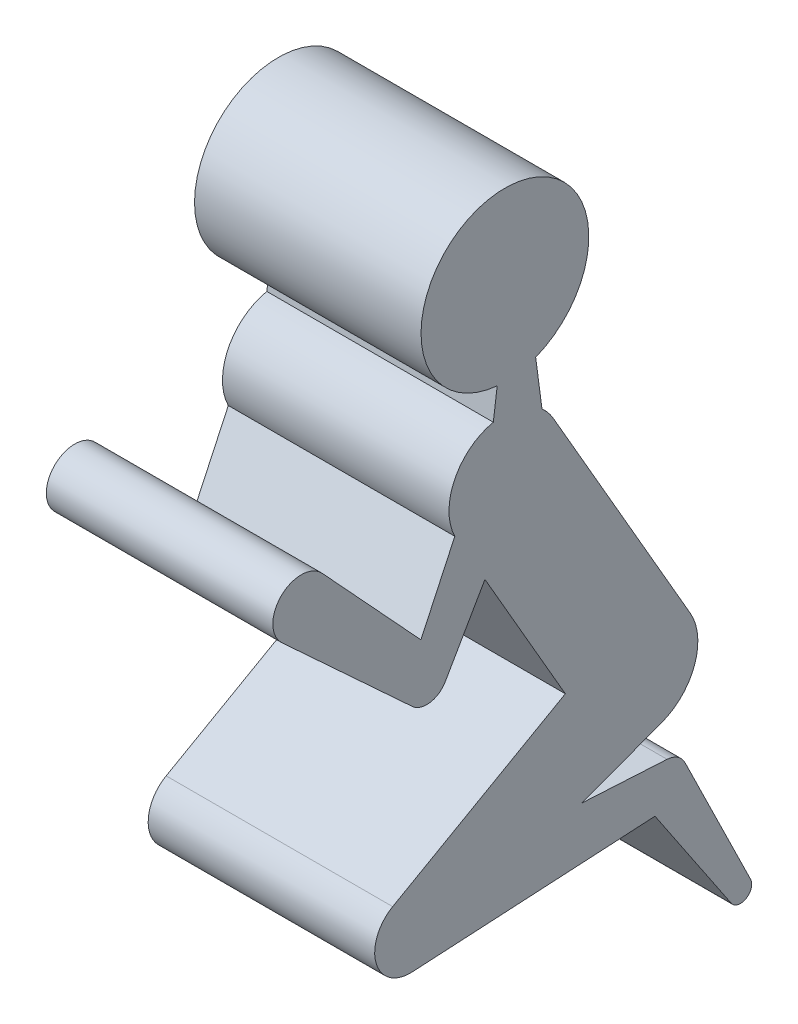
ISO-10303-21;
HEADER;
FILE_DESCRIPTION(('STEP AP214'),'2;1');
FILE_NAME('part.step','',(''),(''),'','','');
FILE_SCHEMA(('AUTOMOTIVE_DESIGN { 1 0 10303 214 1 1 1 1 }'));
ENDSEC;
DATA;
#1=APPLICATION_CONTEXT('core data for automotive mechanical design processes');
#2=APPLICATION_PROTOCOL_DEFINITION('international standard','automotive_design',2000,#1);
#3=PRODUCT_CONTEXT('',#1,'mechanical');
#4=PRODUCT('Part','Part','',(#3));
#5=PRODUCT_RELATED_PRODUCT_CATEGORY('part','',(#4));
#6=PRODUCT_DEFINITION_FORMATION('','',#4);
#7=PRODUCT_DEFINITION_CONTEXT('part definition',#1,'design');
#8=PRODUCT_DEFINITION('design','',#6,#7);
#9=PRODUCT_DEFINITION_SHAPE('','',#8);
#10=(LENGTH_UNIT() NAMED_UNIT(*) SI_UNIT(.MILLI.,.METRE.));
#11=(NAMED_UNIT(*) PLANE_ANGLE_UNIT() SI_UNIT($,.RADIAN.));
#12=(NAMED_UNIT(*) SI_UNIT($,.STERADIAN.) SOLID_ANGLE_UNIT());
#13=UNCERTAINTY_MEASURE_WITH_UNIT(LENGTH_MEASURE(1.E-05),#10,'distance_accuracy_value','');
#14=(GEOMETRIC_REPRESENTATION_CONTEXT(3) GLOBAL_UNCERTAINTY_ASSIGNED_CONTEXT((#13)) GLOBAL_UNIT_ASSIGNED_CONTEXT((#10,
#11,#12)) REPRESENTATION_CONTEXT('',''));
#15=CARTESIAN_POINT('',(0.,0.,0.));
#16=DIRECTION('',(0.,0.,1.));
#17=DIRECTION('',(1.,0.,0.));
#18=AXIS2_PLACEMENT_3D('',#15,#16,#17);
#19=CARTESIAN_POINT('',(202.5,-63.4019304434073,-3.52777777777764));
#20=DIRECTION('',(0.,0.998455597533968,0.055555555555553));
#21=DIRECTION('',(0.,-0.055555555555553,0.998455597533968));
#22=AXIS2_PLACEMENT_3D('',#19,#20,#21);
#23=PLANE('',#22);
#24=DIRECTION('',(0.,0.055555555555553,-0.998455597533968));
#25=VECTOR('',#24,1.);
#26=CARTESIAN_POINT('',(-202.5,-63.4019304434073,-3.52777777777764));
#27=LINE('',#26,#25);
#28=CARTESIAN_POINT('',(-202.5,-63.4019304434073,-3.52777777777763));
#29=VERTEX_POINT('',#28);
#30=CARTESIAN_POINT('',(-202.5,-39.2458724527599,-437.665301449903));
#31=VERTEX_POINT('',#30);
#32=EDGE_CURVE('E228',#29,#31,#27,.T.);
#33=ORIENTED_EDGE('',*,*,#32,.T.);
#34=DIRECTION('',(-1.,0.,0.));
#35=VECTOR('',#34,1.);
#36=CARTESIAN_POINT('',(202.5,-39.2458724527599,-437.665301449903));
#37=LINE('',#36,#35);
#38=CARTESIAN_POINT('',(202.5,-39.2458724527599,-437.665301449903));
#39=VERTEX_POINT('',#38);
#40=EDGE_CURVE('E13',#39,#31,#37,.T.);
#41=ORIENTED_EDGE('',*,*,#40,.F.);
#42=DIRECTION('',(0.,0.055555555555553,-0.998455597533968));
#43=VECTOR('',#42,1.);
#44=CARTESIAN_POINT('',(202.5,-63.4019304434073,-3.52777777777764));
#45=LINE('',#44,#43);
#46=CARTESIAN_POINT('',(202.5,-63.4019304434073,-3.52777777777763));
#47=VERTEX_POINT('',#46);
#48=EDGE_CURVE('E280',#47,#39,#45,.T.);
#49=ORIENTED_EDGE('',*,*,#48,.F.);
#50=DIRECTION('',(-1.,0.,0.));
#51=VECTOR('',#50,1.);
#52=CARTESIAN_POINT('',(202.5,-63.4019304434073,-3.52777777777763));
#53=LINE('',#52,#51);
#54=EDGE_CURVE('E224',#47,#29,#53,.T.);
#55=ORIENTED_EDGE('',*,*,#54,.T.);
#56=EDGE_LOOP('',(#33,#41,#49,#55));
#57=FACE_BOUND('',#56,.T.);
#58=ADVANCED_FACE('F44',(#57),#23,.F.);
#59=CARTESIAN_POINT('',(202.5,190.382873454475,-283.410886607806));
#60=DIRECTION('',(0.,0.55762133255797,-0.830095446003816));
#61=DIRECTION('',(0.,0.830095446003816,0.55762133255797));
#62=AXIS2_PLACEMENT_3D('',#59,#60,#61);
#63=PLANE('',#62);
#64=DIRECTION('',(0.,-0.830095446003816,-0.55762133255797));
#65=VECTOR('',#64,1.);
#66=CARTESIAN_POINT('',(-202.5,190.382873454475,-283.410886607806));
#67=LINE('',#66,#65);
#68=CARTESIAN_POINT('',(-202.5,-242.121401840469,-573.948091079925));
#69=VERTEX_POINT('',#68);
#70=EDGE_CURVE('E231',#31,#69,#67,.T.);
#71=ORIENTED_EDGE('',*,*,#70,.T.);
#72=DIRECTION('',(-1.,0.,0.));
#73=VECTOR('',#72,1.);
#74=CARTESIAN_POINT('',(202.5,-242.121401840469,-573.948091079925));
#75=LINE('',#74,#73);
#76=CARTESIAN_POINT('',(202.5,-242.121401840469,-573.948091079925));
#77=VERTEX_POINT('',#76);
#78=EDGE_CURVE('E52',#77,#69,#75,.T.);
#79=ORIENTED_EDGE('',*,*,#78,.F.);
#80=DIRECTION('',(0.,-0.830095446003816,-0.55762133255797));
#81=VECTOR('',#80,1.);
#82=CARTESIAN_POINT('',(202.5,190.382873454475,-283.410886607806));
#83=LINE('',#82,#81);
#84=EDGE_CURVE('E144',#39,#77,#83,.T.);
#85=ORIENTED_EDGE('',*,*,#84,.F.);
#86=ORIENTED_EDGE('',*,*,#40,.T.);
#87=EDGE_LOOP('',(#71,#79,#85,#86));
#88=FACE_BOUND('',#87,.T.);
#89=ADVANCED_FACE('F399',(#88),#63,.F.);
#90=CARTESIAN_POINT('',(202.5,-230.968975189309,-590.550000000001));
#91=DIRECTION('',(-1.,0.,0.));
#92=DIRECTION('',(0.,0.,1.));
#93=AXIS2_PLACEMENT_3D('',#90,#91,#92);
#94=CYLINDRICAL_SURFACE('',#93,20.0000000000001);
#95=CARTESIAN_POINT('',(-202.5,-230.968975189309,-590.550000000001));
#96=DIRECTION('',(1.,0.,0.));
#97=DIRECTION('',(0.,0.,-1.));
#98=AXIS2_PLACEMENT_3D('',#95,#96,#97);
#99=CIRCLE('',#98,20.0000000000001);
#100=CARTESIAN_POINT('',(-202.5,-222.167513638787,-608.509239253786));
#101=VERTEX_POINT('',#100);
#102=EDGE_CURVE('E233',#69,#101,#99,.T.);
#103=ORIENTED_EDGE('',*,*,#102,.T.);
#104=DIRECTION('',(-1.,0.,0.));
#105=VECTOR('',#104,1.);
#106=CARTESIAN_POINT('',(202.5,-222.167513638787,-608.509239253786));
#107=LINE('',#106,#105);
#108=CARTESIAN_POINT('',(202.5,-222.167513638787,-608.509239253786));
#109=VERTEX_POINT('',#108);
#110=EDGE_CURVE('E326',#109,#101,#107,.T.);
#111=ORIENTED_EDGE('',*,*,#110,.F.);
#112=CARTESIAN_POINT('',(202.5,-230.968975189309,-590.550000000001));
#113=DIRECTION('',(1.,0.,0.));
#114=DIRECTION('',(0.,0.,-1.));
#115=AXIS2_PLACEMENT_3D('',#112,#113,#114);
#116=CIRCLE('',#115,20.0000000000001);
#117=EDGE_CURVE('E333',#77,#109,#116,.T.);
#118=ORIENTED_EDGE('',*,*,#117,.F.);
#119=ORIENTED_EDGE('',*,*,#78,.T.);
#120=EDGE_LOOP('',(#103,#111,#118,#119));
#121=FACE_BOUND('',#120,.T.);
#122=ADVANCED_FACE('F331',(#121),#94,.T.);
#123=CARTESIAN_POINT('',(202.5,197.437998211498,-402.869026617323));
#124=DIRECTION('',(0.,0.440073077526103,-0.897961962689236));
#125=DIRECTION('',(0.,0.897961962689236,0.440073077526103));
#126=AXIS2_PLACEMENT_3D('',#123,#124,#125);
#127=PLANE('',#126);
#128=DIRECTION('',(0.,-0.897961962689236,-0.440073077526103));
#129=VECTOR('',#128,1.);
#130=CARTESIAN_POINT('',(-202.5,197.437998211498,-402.869026617323));
#131=LINE('',#130,#129);
#132=CARTESIAN_POINT('',(-202.5,16.7667842537452,-491.412350778461));
#133=VERTEX_POINT('',#132);
#134=EDGE_CURVE('E236',#133,#101,#131,.T.);
#135=ORIENTED_EDGE('',*,*,#134,.F.);
#136=DIRECTION('',(-1.,0.,0.));
#137=VECTOR('',#136,1.);
#138=CARTESIAN_POINT('',(202.5,16.7667842537452,-491.412350778461));
#139=LINE('',#138,#137);
#140=CARTESIAN_POINT('',(202.5,16.7667842537452,-491.412350778461));
#141=VERTEX_POINT('',#140);
#142=EDGE_CURVE('E324',#141,#133,#139,.T.);
#143=ORIENTED_EDGE('',*,*,#142,.F.);
#144=DIRECTION('',(0.,-0.897961962689236,-0.440073077526103));
#145=VECTOR('',#144,1.);
#146=CARTESIAN_POINT('',(202.5,197.437998211498,-402.869026617323));
#147=LINE('',#146,#145);
#148=EDGE_CURVE('E345',#141,#109,#147,.T.);
#149=ORIENTED_EDGE('',*,*,#148,.T.);
#150=ORIENTED_EDGE('',*,*,#110,.T.);
#151=EDGE_LOOP('',(#135,#143,#149,#150));
#152=FACE_BOUND('',#151,.T.);
#153=ADVANCED_FACE('F341',(#152),#127,.T.);
#154=CARTESIAN_POINT('',(202.5,0.,-457.2));
#155=DIRECTION('',(-1.,0.,0.));
#156=DIRECTION('',(0.,0.,1.));
#157=AXIS2_PLACEMENT_3D('',#154,#155,#156);
#158=CYLINDRICAL_SURFACE('',#157,38.1000000000015);
#159=CARTESIAN_POINT('',(-202.5,0.,-457.2));
#160=DIRECTION('',(1.,0.,0.));
#161=DIRECTION('',(0.,0.,-1.));
#162=AXIS2_PLACEMENT_3D('',#159,#160,#161);
#163=CIRCLE('',#162,38.1000000000015);
#164=CARTESIAN_POINT('',(-202.5,38.0411582660456,-459.316666666667));
#165=VERTEX_POINT('',#164);
#166=EDGE_CURVE('E239',#133,#165,#163,.T.);
#167=ORIENTED_EDGE('',*,*,#166,.T.);
#168=DIRECTION('',(-1.,0.,0.));
#169=VECTOR('',#168,1.);
#170=CARTESIAN_POINT('',(202.5,38.0411582660456,-459.316666666667));
#171=LINE('',#170,#169);
#172=CARTESIAN_POINT('',(202.5,38.0411582660456,-459.316666666667));
#173=VERTEX_POINT('',#172);
#174=EDGE_CURVE('E321',#173,#165,#171,.T.);
#175=ORIENTED_EDGE('',*,*,#174,.F.);
#176=CARTESIAN_POINT('',(202.5,0.,-457.2));
#177=DIRECTION('',(1.,0.,0.));
#178=DIRECTION('',(0.,0.,-1.));
#179=AXIS2_PLACEMENT_3D('',#176,#177,#178);
#180=CIRCLE('',#179,38.1000000000015);
#181=EDGE_CURVE('E346',#141,#173,#180,.T.);
#182=ORIENTED_EDGE('',*,*,#181,.F.);
#183=ORIENTED_EDGE('',*,*,#142,.T.);
#184=EDGE_LOOP('',(#167,#175,#182,#183));
#185=FACE_BOUND('',#184,.T.);
#186=ADVANCED_FACE('F410',(#185),#158,.T.);
#187=CARTESIAN_POINT('',(202.5,63.4019304434073,-3.52777777777763));
#188=DIRECTION('',(0.,-0.998455597533968,0.055555555555553));
#189=DIRECTION('',(0.,-0.055555555555553,-0.998455597533968));
#190=AXIS2_PLACEMENT_3D('',#187,#188,#189);
#191=PLANE('',#190);
#192=DIRECTION('',(0.,0.055555555555553,0.998455597533968));
#193=VECTOR('',#192,1.);
#194=CARTESIAN_POINT('',(-202.5,63.4019304434073,-3.52777777777763));
#195=LINE('',#194,#193);
#196=CARTESIAN_POINT('',(-202.5,46.519626158251,-306.939939607939));
#197=VERTEX_POINT('',#196);
#198=EDGE_CURVE('E241',#165,#197,#195,.T.);
#199=ORIENTED_EDGE('',*,*,#198,.T.);
#200=DIRECTION('',(-1.,0.,0.));
#201=VECTOR('',#200,1.);
#202=CARTESIAN_POINT('',(202.5,46.519626158251,-306.939939607939));
#203=LINE('',#202,#201);
#204=CARTESIAN_POINT('',(202.5,46.519626158251,-306.939939607939));
#205=VERTEX_POINT('',#204);
#206=EDGE_CURVE('E318',#205,#197,#203,.T.);
#207=ORIENTED_EDGE('',*,*,#206,.F.);
#208=DIRECTION('',(0.,0.055555555555553,0.998455597533968));
#209=VECTOR('',#208,1.);
#210=CARTESIAN_POINT('',(202.5,63.4019304434073,-3.52777777777763));
#211=LINE('',#210,#209);
#212=EDGE_CURVE('E348',#173,#205,#211,.T.);
#213=ORIENTED_EDGE('',*,*,#212,.F.);
#214=ORIENTED_EDGE('',*,*,#174,.T.);
#215=EDGE_LOOP('',(#199,#207,#213,#214));
#216=FACE_BOUND('',#215,.T.);
#217=ADVANCED_FACE('F413',(#216),#191,.F.);
#218=CARTESIAN_POINT('',(202.5,-59.509293912752,-22.1561264215054));
#219=DIRECTION('',(0.,0.937154234846484,0.348915376716619));
#220=DIRECTION('',(0.,-0.348915376716619,0.937154234846484));
#221=AXIS2_PLACEMENT_3D('',#218,#219,#220);
#222=PLANE('',#221);
#223=DIRECTION('',(0.,0.348915376716619,-0.937154234846484));
#224=VECTOR('',#223,1.);
#225=CARTESIAN_POINT('',(-202.5,-59.509293912752,-22.1561264215054));
#226=LINE('',#225,#224);
#227=CARTESIAN_POINT('',(-202.5,99.5056457831968,-449.255457904819));
#228=VERTEX_POINT('',#227);
#229=EDGE_CURVE('E243',#197,#228,#226,.T.);
#230=ORIENTED_EDGE('',*,*,#229,.T.);
#231=DIRECTION('',(-1.,0.,0.));
#232=VECTOR('',#231,1.);
#233=CARTESIAN_POINT('',(202.5,99.5056457831968,-449.255457904819));
#234=LINE('',#233,#232);
#235=CARTESIAN_POINT('',(202.5,99.5056457831968,-449.255457904819));
#236=VERTEX_POINT('',#235);
#237=EDGE_CURVE('E315',#236,#228,#234,.T.);
#238=ORIENTED_EDGE('',*,*,#237,.F.);
#239=DIRECTION('',(0.,0.348915376716619,-0.937154234846484));
#240=VECTOR('',#239,1.);
#241=CARTESIAN_POINT('',(202.5,-59.509293912752,-22.1561264215054));
#242=LINE('',#241,#240);
#243=EDGE_CURVE('E354',#205,#236,#242,.T.);
#244=ORIENTED_EDGE('',*,*,#243,.F.);
#245=ORIENTED_EDGE('',*,*,#206,.T.);
#246=EDGE_LOOP('',(#230,#238,#244,#245));
#247=FACE_BOUND('',#246,.T.);
#248=ADVANCED_FACE('F417',(#247),#222,.F.);
#249=CARTESIAN_POINT('',(202.5,193.221069267845,-414.363920233158));
#250=DIRECTION('',(-1.,0.,0.));
#251=DIRECTION('',(0.,0.,1.));
#252=AXIS2_PLACEMENT_3D('',#249,#250,#251);
#253=CYLINDRICAL_SURFACE('',#252,100.);
#254=CARTESIAN_POINT('',(-202.5,193.221069267845,-414.363920233158));
#255=DIRECTION('',(1.,0.,0.));
#256=DIRECTION('',(0.,0.,-1.));
#257=AXIS2_PLACEMENT_3D('',#254,#255,#256);
#258=CIRCLE('',#257,100.);
#259=CARTESIAN_POINT('',(-202.5,243.221069267845,-500.966460611602));
#260=VERTEX_POINT('',#259);
#261=EDGE_CURVE('E245',#228,#260,#258,.T.);
#262=ORIENTED_EDGE('',*,*,#261,.T.);
#263=DIRECTION('',(-1.,0.,0.));
#264=VECTOR('',#263,1.);
#265=CARTESIAN_POINT('',(202.5,243.221069267845,-500.966460611602));
#266=LINE('',#265,#264);
#267=CARTESIAN_POINT('',(202.5,243.221069267845,-500.966460611602));
#268=VERTEX_POINT('',#267);
#269=EDGE_CURVE('E312',#268,#260,#266,.T.);
#270=ORIENTED_EDGE('',*,*,#269,.F.);
#271=CARTESIAN_POINT('',(202.5,193.221069267845,-414.363920233158));
#272=DIRECTION('',(1.,0.,0.));
#273=DIRECTION('',(0.,0.,-1.));
#274=AXIS2_PLACEMENT_3D('',#271,#272,#273);
#275=CIRCLE('',#274,100.);
#276=EDGE_CURVE('E356',#236,#268,#275,.T.);
#277=ORIENTED_EDGE('',*,*,#276,.F.);
#278=ORIENTED_EDGE('',*,*,#237,.T.);
#279=EDGE_LOOP('',(#262,#270,#277,#278));
#280=FACE_BOUND('',#279,.T.);
#281=ADVANCED_FACE('F421',(#280),#253,.T.);
#282=CARTESIAN_POINT('',(202.5,277.730107983771,-481.042657819486));
#283=DIRECTION('',(0.,-0.499999999999997,0.86602540378444));
#284=DIRECTION('',(0.,-0.86602540378444,-0.499999999999997));
#285=AXIS2_PLACEMENT_3D('',#282,#283,#284);
#286=PLANE('',#285);
#287=DIRECTION('',(0.,0.86602540378444,0.499999999999997));
#288=VECTOR('',#287,1.);
#289=CARTESIAN_POINT('',(-202.5,277.730107983771,-481.042657819486));
#290=LINE('',#289,#288);
#291=CARTESIAN_POINT('',(-202.5,667.544072258492,-255.983460611603));
#292=VERTEX_POINT('',#291);
#293=EDGE_CURVE('E247',#260,#292,#290,.T.);
#294=ORIENTED_EDGE('',*,*,#293,.T.);
#295=DIRECTION('',(-1.,0.,0.));
#296=VECTOR('',#295,1.);
#297=CARTESIAN_POINT('',(202.5,667.544072258492,-255.983460611603));
#298=LINE('',#297,#296);
#299=CARTESIAN_POINT('',(202.5,667.544072258492,-255.983460611603));
#300=VERTEX_POINT('',#299);
#301=EDGE_CURVE('E309',#300,#292,#298,.T.);
#302=ORIENTED_EDGE('',*,*,#301,.F.);
#303=DIRECTION('',(0.,0.86602540378444,0.499999999999997));
#304=VECTOR('',#303,1.);
#305=CARTESIAN_POINT('',(202.5,277.730107983771,-481.042657819486));
#306=LINE('',#305,#304);
#307=EDGE_CURVE('E358',#268,#300,#306,.T.);
#308=ORIENTED_EDGE('',*,*,#307,.F.);
#309=ORIENTED_EDGE('',*,*,#269,.T.);
#310=EDGE_LOOP('',(#294,#302,#308,#309));
#311=FACE_BOUND('',#310,.T.);
#312=ADVANCED_FACE('F425',(#311),#286,.F.);
#313=CARTESIAN_POINT('',(202.5,617.544072258492,-169.380920233159));
#314=DIRECTION('',(-1.,0.,0.));
#315=DIRECTION('',(0.,0.,1.));
#316=AXIS2_PLACEMENT_3D('',#313,#314,#315);
#317=CYLINDRICAL_SURFACE('',#316,100.);
#318=CARTESIAN_POINT('',(-202.5,617.544072258492,-169.380920233159));
#319=DIRECTION('',(1.,0.,0.));
#320=DIRECTION('',(0.,0.,-1.));
#321=AXIS2_PLACEMENT_3D('',#318,#319,#320);
#322=CIRCLE('',#321,100.);
#323=CARTESIAN_POINT('',(-202.5,692.438569744066,-235.644139641692));
#324=VERTEX_POINT('',#323);
#325=EDGE_CURVE('E249',#292,#324,#322,.T.);
#326=ORIENTED_EDGE('',*,*,#325,.T.);
#327=DIRECTION('',(-1.,0.,0.));
#328=VECTOR('',#327,1.);
#329=CARTESIAN_POINT('',(202.5,692.438569744066,-235.644139641692));
#330=LINE('',#329,#328);
#331=CARTESIAN_POINT('',(202.5,692.438569744066,-235.644139641692));
#332=VERTEX_POINT('',#331);
#333=EDGE_CURVE('E307',#332,#324,#330,.T.);
#334=ORIENTED_EDGE('',*,*,#333,.F.);
#335=CARTESIAN_POINT('',(202.5,617.544072258492,-169.380920233159));
#336=DIRECTION('',(1.,0.,0.));
#337=DIRECTION('',(0.,0.,-1.));
#338=AXIS2_PLACEMENT_3D('',#335,#336,#337);
#339=CIRCLE('',#338,100.);
#340=EDGE_CURVE('E360',#300,#332,#339,.T.);
#341=ORIENTED_EDGE('',*,*,#340,.F.);
#342=ORIENTED_EDGE('',*,*,#301,.T.);
#343=EDGE_LOOP('',(#326,#334,#341,#342));
#344=FACE_BOUND('',#343,.T.);
#345=ADVANCED_FACE('F429',(#344),#317,.T.);
#346=CARTESIAN_POINT('',(202.5,42.291731657835,-321.237594674287));
#347=DIRECTION('',(0.,0.130526192220044,-0.991444861373811));
#348=DIRECTION('',(0.,0.991444861373811,0.130526192220044));
#349=AXIS2_PLACEMENT_3D('',#346,#347,#348);
#350=PLANE('',#349);
#351=DIRECTION('',(0.,-0.991444861373811,-0.130526192220044));
#352=VECTOR('',#351,1.);
#353=CARTESIAN_POINT('',(-202.5,42.291731657835,-321.237594674287));
#354=LINE('',#353,#352);
#355=CARTESIAN_POINT('',(-202.5,777.991214888963,-224.380920233158));
#356=VERTEX_POINT('',#355);
#357=EDGE_CURVE('E252',#356,#324,#354,.T.);
#358=ORIENTED_EDGE('',*,*,#357,.F.);
#359=DIRECTION('',(-1.,0.,0.));
#360=VECTOR('',#359,1.);
#361=CARTESIAN_POINT('',(202.5,777.991214888963,-224.380920233158));
#362=LINE('',#361,#360);
#363=CARTESIAN_POINT('',(202.5,777.991214888963,-224.380920233158));
#364=VERTEX_POINT('',#363);
#365=EDGE_CURVE('E305',#364,#356,#362,.T.);
#366=ORIENTED_EDGE('',*,*,#365,.F.);
#367=DIRECTION('',(0.,-0.991444861373811,-0.130526192220044));
#368=VECTOR('',#367,1.);
#369=CARTESIAN_POINT('',(202.5,42.291731657835,-321.237594674287));
#370=LINE('',#369,#368);
#371=EDGE_CURVE('E362',#364,#332,#370,.T.);
#372=ORIENTED_EDGE('',*,*,#371,.T.);
#373=ORIENTED_EDGE('',*,*,#333,.T.);
#374=EDGE_LOOP('',(#358,#366,#372,#373));
#375=FACE_BOUND('',#374,.T.);
#376=ADVANCED_FACE('F431',(#375),#350,.T.);
#377=CARTESIAN_POINT('',(202.5,917.544072258493,-169.38092023316));
#378=DIRECTION('',(-1.,0.,0.));
#379=DIRECTION('',(0.,0.,1.));
#380=AXIS2_PLACEMENT_3D('',#377,#378,#379);
#381=CYLINDRICAL_SURFACE('',#380,150.000000000001);
#382=CARTESIAN_POINT('',(-202.5,917.544072258493,-169.38092023316));
#383=DIRECTION('',(1.,0.,0.));
#384=DIRECTION('',(0.,0.,-1.));
#385=AXIS2_PLACEMENT_3D('',#382,#383,#384);
#386=CIRCLE('',#385,150.000000000001);
#387=CARTESIAN_POINT('',(-202.5,768.181554300448,-155.5664991728));
#388=VERTEX_POINT('',#387);
#389=EDGE_CURVE('E256',#356,#388,#386,.T.);
#390=ORIENTED_EDGE('',*,*,#389,.T.);
#391=DIRECTION('',(-1.,0.,0.));
#392=VECTOR('',#391,1.);
#393=CARTESIAN_POINT('',(202.5,768.181554300448,-155.5664991728));
#394=LINE('',#393,#392);
#395=CARTESIAN_POINT('',(202.5,768.181554300448,-155.5664991728));
#396=VERTEX_POINT('',#395);
#397=EDGE_CURVE('E302',#396,#388,#394,.T.);
#398=ORIENTED_EDGE('',*,*,#397,.F.);
#399=CARTESIAN_POINT('',(202.5,917.544072258493,-169.38092023316));
#400=DIRECTION('',(1.,0.,0.));
#401=DIRECTION('',(0.,0.,-1.));
#402=AXIS2_PLACEMENT_3D('',#399,#400,#401);
#403=CIRCLE('',#402,150.000000000001);
#404=EDGE_CURVE('E366',#364,#396,#403,.T.);
#405=ORIENTED_EDGE('',*,*,#404,.F.);
#406=ORIENTED_EDGE('',*,*,#365,.T.);
#407=EDGE_LOOP('',(#390,#398,#405,#406));
#408=FACE_BOUND('',#407,.T.);
#409=ADVANCED_FACE('F434',(#408),#381,.T.);
#410=CARTESIAN_POINT('',(202.5,-7.04421052153994,-53.5060910398916));
#411=DIRECTION('',(0.,-0.130526192220045,-0.991444861373811));
#412=DIRECTION('',(0.,0.991444861373811,-0.130526192220045));
#413=AXIS2_PLACEMENT_3D('',#410,#411,#412);
#414=PLANE('',#413);
#415=DIRECTION('',(0.,-0.991444861373811,0.130526192220045));
#416=VECTOR('',#415,1.);
#417=CARTESIAN_POINT('',(-202.5,-7.04421052153994,-53.5060910398916));
#418=LINE('',#417,#416);
#419=CARTESIAN_POINT('',(-202.5,715.363750631138,-148.612903402655));
#420=VERTEX_POINT('',#419);
#421=EDGE_CURVE('E258',#388,#420,#418,.T.);
#422=ORIENTED_EDGE('',*,*,#421,.T.);
#423=DIRECTION('',(-1.,0.,0.));
#424=VECTOR('',#423,1.);
#425=CARTESIAN_POINT('',(202.5,715.363750631138,-148.612903402655));
#426=LINE('',#425,#424);
#427=CARTESIAN_POINT('',(202.5,715.363750631138,-148.612903402655));
#428=VERTEX_POINT('',#427);
#429=EDGE_CURVE('E299',#428,#420,#426,.T.);
#430=ORIENTED_EDGE('',*,*,#429,.F.);
#431=DIRECTION('',(0.,-0.991444861373811,0.130526192220045));
#432=VECTOR('',#431,1.);
#433=CARTESIAN_POINT('',(202.5,-7.04421052153994,-53.5060910398916));
#434=LINE('',#433,#432);
#435=EDGE_CURVE('E368',#396,#428,#434,.T.);
#436=ORIENTED_EDGE('',*,*,#435,.F.);
#437=ORIENTED_EDGE('',*,*,#397,.T.);
#438=EDGE_LOOP('',(#422,#430,#436,#437));
#439=FACE_BOUND('',#438,.T.);
#440=ADVANCED_FACE('F438',(#439),#414,.F.);
#441=CARTESIAN_POINT('',(-202.5,573.153204370271,-79.773717129108));
#442=VERTEX_POINT('',#441);
#443=EDGE_CURVE('E253',#420,#442,#322,.T.);
#444=ORIENTED_EDGE('',*,*,#443,.T.);
#445=DIRECTION('',(-1.,0.,0.));
#446=VECTOR('',#445,1.);
#447=CARTESIAN_POINT('',(202.5,573.153204370271,-79.773717129108));
#448=LINE('',#447,#446);
#449=CARTESIAN_POINT('',(202.5,573.153204370271,-79.773717129108));
#450=VERTEX_POINT('',#449);
#451=EDGE_CURVE('E296',#450,#442,#448,.T.);
#452=ORIENTED_EDGE('',*,*,#451,.F.);
#453=EDGE_CURVE('E363',#428,#450,#339,.T.);
#454=ORIENTED_EDGE('',*,*,#453,.F.);
#455=ORIENTED_EDGE('',*,*,#429,.T.);
#456=EDGE_LOOP('',(#444,#452,#454,#455));
#457=FACE_BOUND('',#456,.T.);
#458=ADVANCED_FACE('F442',(#457),#317,.T.);
#459=CARTESIAN_POINT('',(202.5,71.8136067176128,154.004776592672));
#460=DIRECTION('',(0.,-0.422618261740699,-0.90630778703665));
#461=DIRECTION('',(0.,0.90630778703665,-0.422618261740699));
#462=AXIS2_PLACEMENT_3D('',#459,#460,#461);
#463=PLANE('',#462);
#464=DIRECTION('',(0.,-0.90630778703665,0.422618261740699));
#465=VECTOR('',#464,1.);
#466=CARTESIAN_POINT('',(-202.5,71.8136067176128,154.004776592672));
#467=LINE('',#466,#465);
#468=CARTESIAN_POINT('',(-202.5,443.154531727686,-19.1543405258856));
#469=VERTEX_POINT('',#468);
#470=EDGE_CURVE('E260',#442,#469,#467,.T.);
#471=ORIENTED_EDGE('',*,*,#470,.T.);
#472=DIRECTION('',(-1.,0.,0.));
#473=VECTOR('',#472,1.);
#474=CARTESIAN_POINT('',(202.5,443.154531727686,-19.1543405258856));
#475=LINE('',#474,#473);
#476=CARTESIAN_POINT('',(202.5,443.154531727686,-19.1543405258856));
#477=VERTEX_POINT('',#476);
#478=EDGE_CURVE('E294',#477,#469,#475,.T.);
#479=ORIENTED_EDGE('',*,*,#478,.F.);
#480=DIRECTION('',(0.,-0.90630778703665,0.422618261740699));
#481=VECTOR('',#480,1.);
#482=CARTESIAN_POINT('',(202.5,71.8136067176128,154.004776592672));
#483=LINE('',#482,#481);
#484=EDGE_CURVE('E370',#450,#477,#483,.T.);
#485=ORIENTED_EDGE('',*,*,#484,.F.);
#486=ORIENTED_EDGE('',*,*,#451,.T.);
#487=EDGE_LOOP('',(#471,#479,#485,#486));
#488=FACE_BOUND('',#487,.T.);
#489=ADVANCED_FACE('F446',(#488),#463,.F.);
#490=CARTESIAN_POINT('',(202.5,213.411794534771,-231.210949312788));
#491=DIRECTION('',(0.,0.678256598058764,-0.734825140553692));
#492=DIRECTION('',(0.,0.734825140553692,0.678256598058764));
#493=AXIS2_PLACEMENT_3D('',#490,#491,#492);
#494=PLANE('',#493);
#495=DIRECTION('',(0.,-0.734825140553692,-0.678256598058764));
#496=VECTOR('',#495,1.);
#497=CARTESIAN_POINT('',(-202.5,213.411794534771,-231.210949312788));
#498=LINE('',#497,#496);
#499=CARTESIAN_POINT('',(-202.5,634.538412649234,157.496365653442));
#500=VERTEX_POINT('',#499);
#501=EDGE_CURVE('E263',#500,#469,#498,.T.);
#502=ORIENTED_EDGE('',*,*,#501,.F.);
#503=DIRECTION('',(-1.,0.,0.));
#504=VECTOR('',#503,1.);
#505=CARTESIAN_POINT('',(202.5,634.538412649234,157.496365653442));
#506=LINE('',#505,#504);
#507=CARTESIAN_POINT('',(202.5,634.538412649234,157.496365653442));
#508=VERTEX_POINT('',#507);
#509=EDGE_CURVE('E292',#508,#500,#506,.T.);
#510=ORIENTED_EDGE('',*,*,#509,.F.);
#511=DIRECTION('',(0.,-0.734825140553692,-0.678256598058764));
#512=VECTOR('',#511,1.);
#513=CARTESIAN_POINT('',(202.5,213.411794534771,-231.210949312788));
#514=LINE('',#513,#512);
#515=EDGE_CURVE('E372',#508,#477,#514,.T.);
#516=ORIENTED_EDGE('',*,*,#515,.T.);
#517=ORIENTED_EDGE('',*,*,#478,.T.);
#518=EDGE_LOOP('',(#502,#510,#516,#517));
#519=FACE_BOUND('',#518,.T.);
#520=ADVANCED_FACE('F450',(#519),#494,.T.);
#521=CARTESIAN_POINT('',(202.5,600.082977467849,194.825482793569));
#522=DIRECTION('',(-1.,0.,0.));
#523=DIRECTION('',(0.,0.,1.));
#524=AXIS2_PLACEMENT_3D('',#521,#522,#523);
#525=CYLINDRICAL_SURFACE('',#524,50.8000000000002);
#526=CARTESIAN_POINT('',(-202.5,600.082977467849,194.825482793569));
#527=DIRECTION('',(1.,0.,0.));
#528=DIRECTION('',(0.,0.,-1.));
#529=AXIS2_PLACEMENT_3D('',#526,#527,#528);
#530=CIRCLE('',#529,50.8000000000002);
#531=CARTESIAN_POINT('',(-202.5,562.753860327721,229.280917974955));
#532=VERTEX_POINT('',#531);
#533=EDGE_CURVE('E266',#500,#532,#530,.T.);
#534=ORIENTED_EDGE('',*,*,#533,.T.);
#535=DIRECTION('',(-1.,0.,0.));
#536=VECTOR('',#535,1.);
#537=CARTESIAN_POINT('',(202.5,562.753860327721,229.280917974955));
#538=LINE('',#537,#536);
#539=CARTESIAN_POINT('',(202.5,562.753860327721,229.280917974955));
#540=VERTEX_POINT('',#539);
#541=EDGE_CURVE('E289',#540,#532,#538,.T.);
#542=ORIENTED_EDGE('',*,*,#541,.F.);
#543=CARTESIAN_POINT('',(202.5,600.082977467849,194.825482793569));
#544=DIRECTION('',(1.,0.,0.));
#545=DIRECTION('',(0.,0.,-1.));
#546=AXIS2_PLACEMENT_3D('',#543,#544,#545);
#547=CIRCLE('',#546,50.8000000000002);
#548=EDGE_CURVE('E375',#508,#540,#547,.T.);
#549=ORIENTED_EDGE('',*,*,#548,.F.);
#550=ORIENTED_EDGE('',*,*,#509,.T.);
#551=EDGE_LOOP('',(#534,#542,#549,#550));
#552=FACE_BOUND('',#551,.T.);
#553=ADVANCED_FACE('F454',(#552),#525,.T.);
#554=CARTESIAN_POINT('',(202.5,189.595459725703,-174.999961792336));
#555=DIRECTION('',(0.,0.734825140553689,-0.678256598058766));
#556=DIRECTION('',(0.,0.678256598058766,0.734825140553689));
#557=AXIS2_PLACEMENT_3D('',#554,#555,#556);
#558=PLANE('',#557);
#559=DIRECTION('',(0.,-0.678256598058766,-0.734825140553689));
#560=VECTOR('',#559,1.);
#561=CARTESIAN_POINT('',(-202.5,189.595459725703,-174.999961792336));
#562=LINE('',#561,#560);
#563=CARTESIAN_POINT('',(-202.5,347.579736586024,-3.83934384712023));
#564=VERTEX_POINT('',#563);
#565=EDGE_CURVE('E268',#532,#564,#562,.T.);
#566=ORIENTED_EDGE('',*,*,#565,.T.);
#567=DIRECTION('',(-1.,0.,0.));
#568=VECTOR('',#567,1.);
#569=CARTESIAN_POINT('',(202.5,347.579736586024,-3.83934384712023));
#570=LINE('',#569,#568);
#571=CARTESIAN_POINT('',(202.5,347.579736586024,-3.83934384712023));
#572=VERTEX_POINT('',#571);
#573=EDGE_CURVE('E286',#572,#564,#570,.T.);
#574=ORIENTED_EDGE('',*,*,#573,.F.);
#575=DIRECTION('',(0.,-0.678256598058766,-0.734825140553689));
#576=VECTOR('',#575,1.);
#577=CARTESIAN_POINT('',(202.5,189.595459725703,-174.999961792336));
#578=LINE('',#577,#576);
#579=EDGE_CURVE('E377',#540,#572,#578,.T.);
#580=ORIENTED_EDGE('',*,*,#579,.F.);
#581=ORIENTED_EDGE('',*,*,#541,.T.);
#582=EDGE_LOOP('',(#566,#574,#580,#581));
#583=FACE_BOUND('',#582,.T.);
#584=ADVANCED_FACE('F458',(#583),#558,.F.);
#585=CARTESIAN_POINT('',(202.5,375.57657444112,-29.6809202331591));
#586=DIRECTION('',(-1.,0.,0.));
#587=DIRECTION('',(0.,0.,1.));
#588=AXIS2_PLACEMENT_3D('',#585,#586,#587);
#589=CYLINDRICAL_SURFACE('',#588,38.0999999999999);
#590=CARTESIAN_POINT('',(-202.5,375.57657444112,-29.6809202331591));
#591=DIRECTION('',(1.,0.,0.));
#592=DIRECTION('',(0.,0.,-1.));
#593=AXIS2_PLACEMENT_3D('',#590,#591,#592);
#594=CIRCLE('',#593,38.0999999999999);
#595=CARTESIAN_POINT('',(-202.5,356.52657444112,-62.6764881173461));
#596=VERTEX_POINT('',#595);
#597=EDGE_CURVE('E270',#564,#596,#594,.T.);
#598=ORIENTED_EDGE('',*,*,#597,.T.);
#599=DIRECTION('',(-1.,0.,0.));
#600=VECTOR('',#599,1.);
#601=CARTESIAN_POINT('',(202.5,356.52657444112,-62.6764881173461));
#602=LINE('',#601,#600);
#603=CARTESIAN_POINT('',(202.5,356.52657444112,-62.6764881173461));
#604=VERTEX_POINT('',#603);
#605=EDGE_CURVE('E284',#604,#596,#602,.T.);
#606=ORIENTED_EDGE('',*,*,#605,.F.);
#607=CARTESIAN_POINT('',(202.5,375.57657444112,-29.6809202331591));
#608=DIRECTION('',(1.,0.,0.));
#609=DIRECTION('',(0.,0.,-1.));
#610=AXIS2_PLACEMENT_3D('',#607,#608,#609);
#611=CIRCLE('',#610,38.0999999999999);
#612=EDGE_CURVE('E379',#572,#604,#611,.T.);
#613=ORIENTED_EDGE('',*,*,#612,.F.);
#614=ORIENTED_EDGE('',*,*,#573,.T.);
#615=EDGE_LOOP('',(#598,#606,#613,#614));
#616=FACE_BOUND('',#615,.T.);
#617=ADVANCED_FACE('F462',(#616),#589,.T.);
#618=CARTESIAN_POINT('',(202.5,61.9919281454723,107.373169207117));
#619=DIRECTION('',(0.,-0.5,-0.866025403784439));
#620=DIRECTION('',(0.,0.866025403784439,-0.5));
#621=AXIS2_PLACEMENT_3D('',#618,#619,#620);
#622=PLANE('',#621);
#623=DIRECTION('',(0.,-0.866025403784439,0.5));
#624=VECTOR('',#623,1.);
#625=CARTESIAN_POINT('',(-202.5,61.9919281454723,107.373169207117));
#626=LINE('',#625,#624);
#627=CARTESIAN_POINT('',(-202.5,479.44407225849,-133.64293857032));
#628=VERTEX_POINT('',#627);
#629=EDGE_CURVE('E273',#628,#596,#626,.T.);
#630=ORIENTED_EDGE('',*,*,#629,.F.);
#631=DIRECTION('',(-1.,0.,0.));
#632=VECTOR('',#631,1.);
#633=CARTESIAN_POINT('',(202.5,479.44407225849,-133.64293857032));
#634=LINE('',#633,#632);
#635=CARTESIAN_POINT('',(202.5,479.44407225849,-133.64293857032));
#636=VERTEX_POINT('',#635);
#637=EDGE_CURVE('E214',#636,#628,#634,.T.);
#638=ORIENTED_EDGE('',*,*,#637,.F.);
#639=DIRECTION('',(0.,-0.866025403784439,0.5));
#640=VECTOR('',#639,1.);
#641=CARTESIAN_POINT('',(202.5,61.9919281454723,107.373169207117));
#642=LINE('',#641,#640);
#643=EDGE_CURVE('E220',#636,#604,#642,.T.);
#644=ORIENTED_EDGE('',*,*,#643,.T.);
#645=ORIENTED_EDGE('',*,*,#605,.T.);
#646=EDGE_LOOP('',(#630,#638,#644,#645));
#647=FACE_BOUND('',#646,.T.);
#648=ADVANCED_FACE('F382',(#647),#622,.T.);
#649=CARTESIAN_POINT('',(202.5,177.730107983773,-307.837577062598));
#650=DIRECTION('',(0.,-0.5,0.866025403784439));
#651=DIRECTION('',(0.,-0.866025403784439,-0.5));
#652=AXIS2_PLACEMENT_3D('',#649,#650,#651);
#653=PLANE('',#652);
#654=DIRECTION('',(0.,0.866025403784439,0.5));
#655=VECTOR('',#654,1.);
#656=CARTESIAN_POINT('',(-202.5,177.730107983773,-307.837577062598));
#657=LINE('',#656,#655);
#658=CARTESIAN_POINT('',(-202.5,230.462283632351,-277.392641256937));
#659=VERTEX_POINT('',#658);
#660=EDGE_CURVE('E209',#659,#628,#657,.T.);
#661=ORIENTED_EDGE('',*,*,#660,.F.);
#662=DIRECTION('',(-1.,0.,0.));
#663=VECTOR('',#662,1.);
#664=CARTESIAN_POINT('',(202.5,230.462283632351,-277.392641256937));
#665=LINE('',#664,#663);
#666=CARTESIAN_POINT('',(202.5,230.462283632351,-277.392641256937));
#667=VERTEX_POINT('',#666);
#668=EDGE_CURVE('E204',#667,#659,#665,.T.);
#669=ORIENTED_EDGE('',*,*,#668,.F.);
#670=DIRECTION('',(0.,0.866025403784439,0.5));
#671=VECTOR('',#670,1.);
#672=CARTESIAN_POINT('',(202.5,177.730107983773,-307.837577062598));
#673=LINE('',#672,#671);
#674=EDGE_CURVE('E207',#667,#636,#673,.T.);
#675=ORIENTED_EDGE('',*,*,#674,.T.);
#676=ORIENTED_EDGE('',*,*,#637,.T.);
#677=EDGE_LOOP('',(#661,#669,#675,#676));
#678=FACE_BOUND('',#677,.T.);
#679=ADVANCED_FACE('F206',(#678),#653,.T.);
#680=CARTESIAN_POINT('',(202.5,55.2244143145478,31.3450803734048));
#681=DIRECTION('',(0.,0.869675815977127,0.493623312967002));
#682=DIRECTION('',(0.,-0.493623312967002,0.869675815977127));
#683=AXIS2_PLACEMENT_3D('',#680,#681,#682);
#684=PLANE('',#683);
#685=DIRECTION('',(0.,0.493623312967002,-0.869675815977127));
#686=VECTOR('',#685,1.);
#687=CARTESIAN_POINT('',(-202.5,55.2244143145478,31.3450803734048));
#688=LINE('',#687,#686);
#689=CARTESIAN_POINT('',(-202.5,55.2244143145478,31.3450803734048));
#690=VERTEX_POINT('',#689);
#691=EDGE_CURVE('E277',#690,#659,#688,.T.);
#692=ORIENTED_EDGE('',*,*,#691,.F.);
#693=DIRECTION('',(-1.,0.,0.));
#694=VECTOR('',#693,1.);
#695=CARTESIAN_POINT('',(202.5,55.2244143145478,31.3450803734048));
#696=LINE('',#695,#694);
#697=CARTESIAN_POINT('',(202.5,55.2244143145478,31.3450803734048));
#698=VERTEX_POINT('',#697);
#699=EDGE_CURVE('E133',#698,#690,#696,.T.);
#700=ORIENTED_EDGE('',*,*,#699,.F.);
#701=DIRECTION('',(0.,0.493623312967002,-0.869675815977127));
#702=VECTOR('',#701,1.);
#703=CARTESIAN_POINT('',(202.5,55.2244143145478,31.3450803734048));
#704=LINE('',#703,#702);
#705=EDGE_CURVE('E218',#698,#667,#704,.T.);
#706=ORIENTED_EDGE('',*,*,#705,.T.);
#707=ORIENTED_EDGE('',*,*,#668,.T.);
#708=EDGE_LOOP('',(#692,#700,#706,#707));
#709=FACE_BOUND('',#708,.T.);
#710=ADVANCED_FACE('F222',(#709),#684,.T.);
#711=CARTESIAN_POINT('',(202.5,0.,0.));
#712=DIRECTION('',(-1.,0.,0.));
#713=DIRECTION('',(0.,0.,1.));
#714=AXIS2_PLACEMENT_3D('',#711,#712,#713);
#715=CYLINDRICAL_SURFACE('',#714,63.5000000000003);
#716=CARTESIAN_POINT('',(-202.5,0.,0.));
#717=DIRECTION('',(1.,0.,0.));
#718=DIRECTION('',(0.,0.,-1.));
#719=AXIS2_PLACEMENT_3D('',#716,#717,#718);
#720=CIRCLE('',#719,63.5000000000003);
#721=EDGE_CURVE('E136',#690,#29,#720,.T.);
#722=ORIENTED_EDGE('',*,*,#721,.T.);
#723=ORIENTED_EDGE('',*,*,#54,.F.);
#724=CARTESIAN_POINT('',(202.5,0.,0.));
#725=DIRECTION('',(1.,0.,0.));
#726=DIRECTION('',(0.,0.,-1.));
#727=AXIS2_PLACEMENT_3D('',#724,#725,#726);
#728=CIRCLE('',#727,63.5000000000003);
#729=EDGE_CURVE('E60',#698,#47,#728,.T.);
#730=ORIENTED_EDGE('',*,*,#729,.F.);
#731=ORIENTED_EDGE('',*,*,#699,.T.);
#732=EDGE_LOOP('',(#722,#723,#730,#731));
#733=FACE_BOUND('',#732,.T.);
#734=ADVANCED_FACE('F388',(#733),#715,.T.);
#735=CARTESIAN_POINT('',(202.5,0.,0.));
#736=DIRECTION('',(1.,0.,0.));
#737=DIRECTION('',(0.,0.,-1.));
#738=AXIS2_PLACEMENT_3D('',#735,#736,#737);
#739=PLANE('',#738);
#740=ORIENTED_EDGE('',*,*,#48,.T.);
#741=ORIENTED_EDGE('',*,*,#84,.T.);
#742=ORIENTED_EDGE('',*,*,#117,.T.);
#743=ORIENTED_EDGE('',*,*,#148,.F.);
#744=ORIENTED_EDGE('',*,*,#181,.T.);
#745=ORIENTED_EDGE('',*,*,#212,.T.);
#746=ORIENTED_EDGE('',*,*,#243,.T.);
#747=ORIENTED_EDGE('',*,*,#276,.T.);
#748=ORIENTED_EDGE('',*,*,#307,.T.);
#749=ORIENTED_EDGE('',*,*,#340,.T.);
#750=ORIENTED_EDGE('',*,*,#371,.F.);
#751=ORIENTED_EDGE('',*,*,#404,.T.);
#752=ORIENTED_EDGE('',*,*,#435,.T.);
#753=ORIENTED_EDGE('',*,*,#453,.T.);
#754=ORIENTED_EDGE('',*,*,#484,.T.);
#755=ORIENTED_EDGE('',*,*,#515,.F.);
#756=ORIENTED_EDGE('',*,*,#548,.T.);
#757=ORIENTED_EDGE('',*,*,#579,.T.);
#758=ORIENTED_EDGE('',*,*,#612,.T.);
#759=ORIENTED_EDGE('',*,*,#643,.F.);
#760=ORIENTED_EDGE('',*,*,#674,.F.);
#761=ORIENTED_EDGE('',*,*,#705,.F.);
#762=ORIENTED_EDGE('',*,*,#729,.T.);
#763=EDGE_LOOP('',(#740,#741,#742,#743,#744,#745,#746,#747,#748,#749,#750,#751,#752,#753,#754,
#755,#756,#757,#758,#759,#760,#761,#762));
#764=FACE_BOUND('',#763,.T.);
#765=ADVANCED_FACE('F217',(#764),#739,.T.);
#766=CARTESIAN_POINT('',(-202.5,0.,0.));
#767=DIRECTION('',(1.,0.,0.));
#768=DIRECTION('',(0.,0.,-1.));
#769=AXIS2_PLACEMENT_3D('',#766,#767,#768);
#770=PLANE('',#769);
#771=ORIENTED_EDGE('',*,*,#32,.F.);
#772=ORIENTED_EDGE('',*,*,#721,.F.);
#773=ORIENTED_EDGE('',*,*,#691,.T.);
#774=ORIENTED_EDGE('',*,*,#660,.T.);
#775=ORIENTED_EDGE('',*,*,#629,.T.);
#776=ORIENTED_EDGE('',*,*,#597,.F.);
#777=ORIENTED_EDGE('',*,*,#565,.F.);
#778=ORIENTED_EDGE('',*,*,#533,.F.);
#779=ORIENTED_EDGE('',*,*,#501,.T.);
#780=ORIENTED_EDGE('',*,*,#470,.F.);
#781=ORIENTED_EDGE('',*,*,#443,.F.);
#782=ORIENTED_EDGE('',*,*,#421,.F.);
#783=ORIENTED_EDGE('',*,*,#389,.F.);
#784=ORIENTED_EDGE('',*,*,#357,.T.);
#785=ORIENTED_EDGE('',*,*,#325,.F.);
#786=ORIENTED_EDGE('',*,*,#293,.F.);
#787=ORIENTED_EDGE('',*,*,#261,.F.);
#788=ORIENTED_EDGE('',*,*,#229,.F.);
#789=ORIENTED_EDGE('',*,*,#198,.F.);
#790=ORIENTED_EDGE('',*,*,#166,.F.);
#791=ORIENTED_EDGE('',*,*,#134,.T.);
#792=ORIENTED_EDGE('',*,*,#102,.F.);
#793=ORIENTED_EDGE('',*,*,#70,.F.);
#794=EDGE_LOOP('',(#771,#772,#773,#774,#775,#776,#777,#778,#779,#780,#781,#782,#783,#784,#785,
#786,#787,#788,#789,#790,#791,#792,#793));
#795=FACE_BOUND('',#794,.T.);
#796=ADVANCED_FACE('F336',(#795),#770,.F.);
#797=CLOSED_SHELL('',(#58,#89,#122,#153,#186,#217,#248,#281,#312,#345,#376,#409,#440,#458,#489,
#520,#553,#584,#617,#648,#679,#710,#734,#765,#796));
#798=MANIFOLD_SOLID_BREP('B2',#797);
#799=ADVANCED_BREP_SHAPE_REPRESENTATION('',(#18,#798),#14);
#800=SHAPE_DEFINITION_REPRESENTATION(#9,#799);
ENDSEC;
END-ISO-10303-21;
